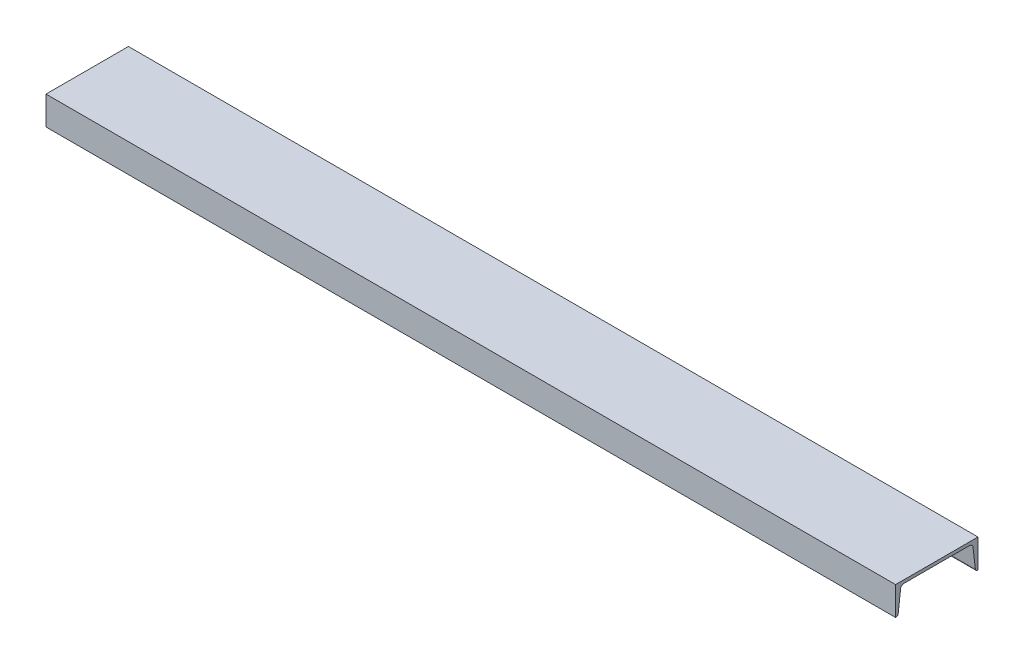
ISO-10303-21;
HEADER;
FILE_DESCRIPTION(('STEP AP214'),'2;1');
FILE_NAME('part.step','',(''),(''),'','','');
FILE_SCHEMA(('AUTOMOTIVE_DESIGN { 1 0 10303 214 1 1 1 1 }'));
ENDSEC;
DATA;
#1=APPLICATION_CONTEXT('core data for automotive mechanical design processes');
#2=APPLICATION_PROTOCOL_DEFINITION('international standard','automotive_design',2000,#1);
#3=PRODUCT_CONTEXT('',#1,'mechanical');
#4=PRODUCT('Part','Part','',(#3));
#5=PRODUCT_RELATED_PRODUCT_CATEGORY('part','',(#4));
#6=PRODUCT_DEFINITION_FORMATION('','',#4);
#7=PRODUCT_DEFINITION_CONTEXT('part definition',#1,'design');
#8=PRODUCT_DEFINITION('design','',#6,#7);
#9=PRODUCT_DEFINITION_SHAPE('','',#8);
#10=(LENGTH_UNIT() NAMED_UNIT(*) SI_UNIT(.MILLI.,.METRE.));
#11=(NAMED_UNIT(*) PLANE_ANGLE_UNIT() SI_UNIT($,.RADIAN.));
#12=(NAMED_UNIT(*) SI_UNIT($,.STERADIAN.) SOLID_ANGLE_UNIT());
#13=UNCERTAINTY_MEASURE_WITH_UNIT(LENGTH_MEASURE(1.E-05),#10,'distance_accuracy_value','');
#14=(GEOMETRIC_REPRESENTATION_CONTEXT(3) GLOBAL_UNCERTAINTY_ASSIGNED_CONTEXT((#13)) GLOBAL_UNIT_ASSIGNED_CONTEXT((#10,
#11,#12)) REPRESENTATION_CONTEXT('',''));
#15=CARTESIAN_POINT('',(0.,0.,0.));
#16=DIRECTION('',(0.,0.,1.));
#17=DIRECTION('',(1.,0.,0.));
#18=AXIS2_PLACEMENT_3D('',#15,#16,#17);
#19=CARTESIAN_POINT('',(2680.,0.,-130.));
#20=DIRECTION('',(0.,0.,-1.));
#21=DIRECTION('',(-1.,0.,0.));
#22=AXIS2_PLACEMENT_3D('',#19,#20,#21);
#23=PLANE('',#22);
#24=DIRECTION('',(0.,-1.,0.));
#25=VECTOR('',#24,1.);
#26=CARTESIAN_POINT('',(0.,0.,-130.));
#27=LINE('',#26,#25);
#28=CARTESIAN_POINT('',(0.,0.,-130.));
#29=VERTEX_POINT('',#28);
#30=CARTESIAN_POINT('',(0.,-90.,-130.));
#31=VERTEX_POINT('',#30);
#32=EDGE_CURVE('E157',#29,#31,#27,.T.);
#33=ORIENTED_EDGE('',*,*,#32,.F.);
#34=DIRECTION('',(-1.,0.,0.));
#35=VECTOR('',#34,1.);
#36=CARTESIAN_POINT('',(2680.,0.,-130.));
#37=LINE('',#36,#35);
#38=CARTESIAN_POINT('',(2680.,0.,-130.));
#39=VERTEX_POINT('',#38);
#40=EDGE_CURVE('E11',#39,#29,#37,.T.);
#41=ORIENTED_EDGE('',*,*,#40,.F.);
#42=DIRECTION('',(0.,-1.,0.));
#43=VECTOR('',#42,1.);
#44=CARTESIAN_POINT('',(2680.,0.,-130.));
#45=LINE('',#44,#43);
#46=CARTESIAN_POINT('',(2680.,-90.,-130.));
#47=VERTEX_POINT('',#46);
#48=EDGE_CURVE('E186',#39,#47,#45,.T.);
#49=ORIENTED_EDGE('',*,*,#48,.T.);
#50=DIRECTION('',(-1.,0.,0.));
#51=VECTOR('',#50,1.);
#52=CARTESIAN_POINT('',(2680.,-90.,-130.));
#53=LINE('',#52,#51);
#54=EDGE_CURVE('E38',#47,#31,#53,.T.);
#55=ORIENTED_EDGE('',*,*,#54,.T.);
#56=EDGE_LOOP('',(#33,#41,#49,#55));
#57=FACE_BOUND('',#56,.T.);
#58=ADVANCED_FACE('F35',(#57),#23,.T.);
#59=CARTESIAN_POINT('',(2680.,0.,-130.));
#60=DIRECTION('',(0.,-1.,0.));
#61=DIRECTION('',(0.,0.,-1.));
#62=AXIS2_PLACEMENT_3D('',#59,#60,#61);
#63=PLANE('',#62);
#64=DIRECTION('',(0.,0.,1.));
#65=VECTOR('',#64,1.);
#66=CARTESIAN_POINT('',(0.,0.,-130.));
#67=LINE('',#66,#65);
#68=CARTESIAN_POINT('',(0.,0.,130.));
#69=VERTEX_POINT('',#68);
#70=EDGE_CURVE('E92',#29,#69,#67,.T.);
#71=ORIENTED_EDGE('',*,*,#70,.T.);
#72=DIRECTION('',(-1.,0.,0.));
#73=VECTOR('',#72,1.);
#74=CARTESIAN_POINT('',(2680.,0.,130.));
#75=LINE('',#74,#73);
#76=CARTESIAN_POINT('',(2680.,0.,130.));
#77=VERTEX_POINT('',#76);
#78=EDGE_CURVE('E44',#77,#69,#75,.T.);
#79=ORIENTED_EDGE('',*,*,#78,.F.);
#80=DIRECTION('',(0.,0.,1.));
#81=VECTOR('',#80,1.);
#82=CARTESIAN_POINT('',(2680.,0.,-130.));
#83=LINE('',#82,#81);
#84=EDGE_CURVE('E135',#39,#77,#83,.T.);
#85=ORIENTED_EDGE('',*,*,#84,.F.);
#86=ORIENTED_EDGE('',*,*,#40,.T.);
#87=EDGE_LOOP('',(#71,#79,#85,#86));
#88=FACE_BOUND('',#87,.T.);
#89=ADVANCED_FACE('F262',(#88),#63,.F.);
#90=CARTESIAN_POINT('',(2680.,0.,130.));
#91=DIRECTION('',(0.,0.,-1.));
#92=DIRECTION('',(-1.,0.,0.));
#93=AXIS2_PLACEMENT_3D('',#90,#91,#92);
#94=PLANE('',#93);
#95=DIRECTION('',(0.,-1.,0.));
#96=VECTOR('',#95,1.);
#97=CARTESIAN_POINT('',(0.,0.,130.));
#98=LINE('',#97,#96);
#99=CARTESIAN_POINT('',(0.,-90.,130.));
#100=VERTEX_POINT('',#99);
#101=EDGE_CURVE('E142',#69,#100,#98,.T.);
#102=ORIENTED_EDGE('',*,*,#101,.T.);
#103=DIRECTION('',(-1.,0.,0.));
#104=VECTOR('',#103,1.);
#105=CARTESIAN_POINT('',(2680.,-90.,130.));
#106=LINE('',#105,#104);
#107=CARTESIAN_POINT('',(2680.,-90.,130.));
#108=VERTEX_POINT('',#107);
#109=EDGE_CURVE('E139',#108,#100,#106,.T.);
#110=ORIENTED_EDGE('',*,*,#109,.F.);
#111=DIRECTION('',(0.,-1.,0.));
#112=VECTOR('',#111,1.);
#113=CARTESIAN_POINT('',(2680.,0.,130.));
#114=LINE('',#113,#112);
#115=EDGE_CURVE('E128',#77,#108,#114,.T.);
#116=ORIENTED_EDGE('',*,*,#115,.F.);
#117=ORIENTED_EDGE('',*,*,#78,.T.);
#118=EDGE_LOOP('',(#102,#110,#116,#117));
#119=FACE_BOUND('',#118,.T.);
#120=ADVANCED_FACE('F140',(#119),#94,.F.);
#121=CARTESIAN_POINT('',(2680.,-90.,130.));
#122=DIRECTION('',(0.,1.,0.));
#123=DIRECTION('',(0.,0.,1.));
#124=AXIS2_PLACEMENT_3D('',#121,#122,#123);
#125=PLANE('',#124);
#126=DIRECTION('',(0.,0.,-1.));
#127=VECTOR('',#126,1.);
#128=CARTESIAN_POINT('',(0.,-90.,130.));
#129=LINE('',#128,#127);
#130=CARTESIAN_POINT('',(0.,-90.,128.678333405021));
#131=VERTEX_POINT('',#130);
#132=EDGE_CURVE('E183',#100,#131,#129,.T.);
#133=ORIENTED_EDGE('',*,*,#132,.T.);
#134=DIRECTION('',(-1.,0.,0.));
#135=VECTOR('',#134,1.);
#136=CARTESIAN_POINT('',(2680.,-90.,128.678333405021));
#137=LINE('',#136,#135);
#138=CARTESIAN_POINT('',(2680.,-90.,128.678333405021));
#139=VERTEX_POINT('',#138);
#140=EDGE_CURVE('E145',#139,#131,#137,.T.);
#141=ORIENTED_EDGE('',*,*,#140,.F.);
#142=DIRECTION('',(0.,0.,-1.));
#143=VECTOR('',#142,1.);
#144=CARTESIAN_POINT('',(2680.,-90.,130.));
#145=LINE('',#144,#143);
#146=EDGE_CURVE('E133',#108,#139,#145,.T.);
#147=ORIENTED_EDGE('',*,*,#146,.F.);
#148=ORIENTED_EDGE('',*,*,#109,.T.);
#149=EDGE_LOOP('',(#133,#141,#147,#148));
#150=FACE_BOUND('',#149,.T.);
#151=ADVANCED_FACE('F147',(#150),#125,.F.);
#152=CARTESIAN_POINT('',(2680.,-83.,128.678333405021));
#153=DIRECTION('',(-1.,0.,0.));
#154=DIRECTION('',(0.,0.,1.));
#155=AXIS2_PLACEMENT_3D('',#152,#153,#154);
#156=CYLINDRICAL_SURFACE('',#155,7.00000000000001);
#157=CARTESIAN_POINT('',(0.,-83.,128.678333405021));
#158=DIRECTION('',(1.,0.,0.));
#159=DIRECTION('',(0.,0.,-1.));
#160=AXIS2_PLACEMENT_3D('',#157,#158,#159);
#161=CIRCLE('',#160,7.00000000000001);
#162=CARTESIAN_POINT('',(0.,-83.8216184771156,121.726718982597));
#163=VERTEX_POINT('',#162);
#164=EDGE_CURVE('E180',#131,#163,#161,.T.);
#165=ORIENTED_EDGE('',*,*,#164,.T.);
#166=DIRECTION('',(-1.,0.,0.));
#167=VECTOR('',#166,1.);
#168=CARTESIAN_POINT('',(2680.,-83.8216184771156,121.726718982597));
#169=LINE('',#168,#167);
#170=CARTESIAN_POINT('',(2680.,-83.8216184771156,121.726718982597));
#171=VERTEX_POINT('',#170);
#172=EDGE_CURVE('E190',#171,#163,#169,.T.);
#173=ORIENTED_EDGE('',*,*,#172,.F.);
#174=CARTESIAN_POINT('',(2680.,-83.,128.678333405021));
#175=DIRECTION('',(1.,0.,0.));
#176=DIRECTION('',(0.,0.,-1.));
#177=AXIS2_PLACEMENT_3D('',#174,#175,#176);
#178=CIRCLE('',#177,7.00000000000001);
#179=EDGE_CURVE('E150',#139,#171,#178,.T.);
#180=ORIENTED_EDGE('',*,*,#179,.F.);
#181=ORIENTED_EDGE('',*,*,#140,.T.);
#182=EDGE_LOOP('',(#165,#173,#180,#181));
#183=FACE_BOUND('',#182,.T.);
#184=ADVANCED_FACE('F209',(#183),#156,.T.);
#185=CARTESIAN_POINT('',(2680.,-16.7206222894941,113.795983048398));
#186=DIRECTION('',(0.,-0.117374068159373,-0.993087774632091));
#187=DIRECTION('',(0.,0.993087774632091,-0.117374068159373));
#188=AXIS2_PLACEMENT_3D('',#185,#186,#187);
#189=PLANE('',#188);
#190=DIRECTION('',(0.,-0.993087774632091,0.117374068159373));
#191=VECTOR('',#190,1.);
#192=CARTESIAN_POINT('',(0.,-16.7206222894941,113.795983048398));
#193=LINE('',#192,#191);
#194=CARTESIAN_POINT('',(0.,-16.7206222894941,113.795983048398));
#195=VERTEX_POINT('',#194);
#196=EDGE_CURVE('E177',#195,#163,#193,.T.);
#197=ORIENTED_EDGE('',*,*,#196,.F.);
#198=DIRECTION('',(-1.,0.,0.));
#199=VECTOR('',#198,1.);
#200=CARTESIAN_POINT('',(2680.,-16.7206222894941,113.795983048398));
#201=LINE('',#200,#199);
#202=CARTESIAN_POINT('',(2680.,-16.7206222894941,113.795983048398));
#203=VERTEX_POINT('',#202);
#204=EDGE_CURVE('E192',#203,#195,#201,.T.);
#205=ORIENTED_EDGE('',*,*,#204,.F.);
#206=DIRECTION('',(0.,-0.993087774632091,0.117374068159373));
#207=VECTOR('',#206,1.);
#208=CARTESIAN_POINT('',(2680.,-16.7206222894941,113.795983048398));
#209=LINE('',#208,#207);
#210=EDGE_CURVE('E152',#203,#171,#209,.T.);
#211=ORIENTED_EDGE('',*,*,#210,.T.);
#212=ORIENTED_EDGE('',*,*,#172,.T.);
#213=EDGE_LOOP('',(#197,#205,#211,#212));
#214=FACE_BOUND('',#213,.T.);
#215=ADVANCED_FACE('F252',(#214),#189,.T.);
#216=CARTESIAN_POINT('',(2680.,-24.,101.837276590433));
#217=DIRECTION('',(-1.,0.,0.));
#218=DIRECTION('',(0.,0.,1.));
#219=AXIS2_PLACEMENT_3D('',#216,#217,#218);
#220=CYLINDRICAL_SURFACE('',#219,14.);
#221=CARTESIAN_POINT('',(0.,-24.,101.837276590433));
#222=DIRECTION('',(1.,0.,0.));
#223=DIRECTION('',(0.,0.,-1.));
#224=AXIS2_PLACEMENT_3D('',#221,#222,#223);
#225=CIRCLE('',#224,14.);
#226=CARTESIAN_POINT('',(0.,-10.,101.837276590433));
#227=VERTEX_POINT('',#226);
#228=EDGE_CURVE('E174',#227,#195,#225,.T.);
#229=ORIENTED_EDGE('',*,*,#228,.F.);
#230=DIRECTION('',(-1.,0.,0.));
#231=VECTOR('',#230,1.);
#232=CARTESIAN_POINT('',(2680.,-10.,101.837276590433));
#233=LINE('',#232,#231);
#234=CARTESIAN_POINT('',(2680.,-10.,101.837276590433));
#235=VERTEX_POINT('',#234);
#236=EDGE_CURVE('E194',#235,#227,#233,.T.);
#237=ORIENTED_EDGE('',*,*,#236,.F.);
#238=CARTESIAN_POINT('',(2680.,-24.,101.837276590433));
#239=DIRECTION('',(1.,0.,0.));
#240=DIRECTION('',(0.,0.,-1.));
#241=AXIS2_PLACEMENT_3D('',#238,#239,#240);
#242=CIRCLE('',#241,14.);
#243=EDGE_CURVE('E216',#235,#203,#242,.T.);
#244=ORIENTED_EDGE('',*,*,#243,.T.);
#245=ORIENTED_EDGE('',*,*,#204,.T.);
#246=EDGE_LOOP('',(#229,#237,#244,#245));
#247=FACE_BOUND('',#246,.T.);
#248=ADVANCED_FACE('F221',(#247),#220,.F.);
#249=CARTESIAN_POINT('',(2680.,-9.99999999999998,-101.837276590433));
#250=DIRECTION('',(0.,-1.,0.));
#251=DIRECTION('',(0.,0.,-1.));
#252=AXIS2_PLACEMENT_3D('',#249,#250,#251);
#253=PLANE('',#252);
#254=DIRECTION('',(0.,0.,1.));
#255=VECTOR('',#254,1.);
#256=CARTESIAN_POINT('',(0.,-9.99999999999998,-101.837276590433));
#257=LINE('',#256,#255);
#258=CARTESIAN_POINT('',(0.,-9.99999999999998,-101.837276590433));
#259=VERTEX_POINT('',#258);
#260=EDGE_CURVE('E171',#259,#227,#257,.T.);
#261=ORIENTED_EDGE('',*,*,#260,.F.);
#262=DIRECTION('',(-1.,0.,0.));
#263=VECTOR('',#262,1.);
#264=CARTESIAN_POINT('',(2680.,-9.99999999999998,-101.837276590433));
#265=LINE('',#264,#263);
#266=CARTESIAN_POINT('',(2680.,-9.99999999999998,-101.837276590433));
#267=VERTEX_POINT('',#266);
#268=EDGE_CURVE('E196',#267,#259,#265,.T.);
#269=ORIENTED_EDGE('',*,*,#268,.F.);
#270=DIRECTION('',(0.,0.,1.));
#271=VECTOR('',#270,1.);
#272=CARTESIAN_POINT('',(2680.,-9.99999999999998,-101.837276590433));
#273=LINE('',#272,#271);
#274=EDGE_CURVE('E223',#267,#235,#273,.T.);
#275=ORIENTED_EDGE('',*,*,#274,.T.);
#276=ORIENTED_EDGE('',*,*,#236,.T.);
#277=EDGE_LOOP('',(#261,#269,#275,#276));
#278=FACE_BOUND('',#277,.T.);
#279=ADVANCED_FACE('F251',(#278),#253,.T.);
#280=CARTESIAN_POINT('',(2680.,-24.,-101.837276590433));
#281=DIRECTION('',(-1.,0.,0.));
#282=DIRECTION('',(0.,0.,1.));
#283=AXIS2_PLACEMENT_3D('',#280,#281,#282);
#284=CYLINDRICAL_SURFACE('',#283,14.);
#285=CARTESIAN_POINT('',(0.,-24.,-101.837276590433));
#286=DIRECTION('',(-1.,0.,0.));
#287=DIRECTION('',(0.,0.,1.));
#288=AXIS2_PLACEMENT_3D('',#285,#286,#287);
#289=CIRCLE('',#288,14.);
#290=CARTESIAN_POINT('',(0.,-16.7206222894941,-113.795983048398));
#291=VERTEX_POINT('',#290);
#292=EDGE_CURVE('E169',#259,#291,#289,.T.);
#293=ORIENTED_EDGE('',*,*,#292,.T.);
#294=DIRECTION('',(-1.,0.,0.));
#295=VECTOR('',#294,1.);
#296=CARTESIAN_POINT('',(2680.,-16.7206222894941,-113.795983048398));
#297=LINE('',#296,#295);
#298=CARTESIAN_POINT('',(2680.,-16.7206222894941,-113.795983048398));
#299=VERTEX_POINT('',#298);
#300=EDGE_CURVE('E198',#299,#291,#297,.T.);
#301=ORIENTED_EDGE('',*,*,#300,.F.);
#302=CARTESIAN_POINT('',(2680.,-24.,-101.837276590433));
#303=DIRECTION('',(-1.,0.,0.));
#304=DIRECTION('',(0.,0.,1.));
#305=AXIS2_PLACEMENT_3D('',#302,#303,#304);
#306=CIRCLE('',#305,14.);
#307=EDGE_CURVE('E225',#267,#299,#306,.T.);
#308=ORIENTED_EDGE('',*,*,#307,.F.);
#309=ORIENTED_EDGE('',*,*,#268,.T.);
#310=EDGE_LOOP('',(#293,#301,#308,#309));
#311=FACE_BOUND('',#310,.T.);
#312=ADVANCED_FACE('F249',(#311),#284,.F.);
#313=CARTESIAN_POINT('',(2680.,-16.7206222894941,-113.795983048398));
#314=DIRECTION('',(0.,0.117374068159373,-0.993087774632091));
#315=DIRECTION('',(0.,0.993087774632091,0.117374068159373));
#316=AXIS2_PLACEMENT_3D('',#313,#314,#315);
#317=PLANE('',#316);
#318=DIRECTION('',(0.,-0.993087774632091,-0.117374068159373));
#319=VECTOR('',#318,1.);
#320=CARTESIAN_POINT('',(0.,-16.7206222894941,-113.795983048398));
#321=LINE('',#320,#319);
#322=CARTESIAN_POINT('',(0.,-83.8216184771156,-121.726718982597));
#323=VERTEX_POINT('',#322);
#324=EDGE_CURVE('E166',#291,#323,#321,.T.);
#325=ORIENTED_EDGE('',*,*,#324,.T.);
#326=DIRECTION('',(-1.,0.,0.));
#327=VECTOR('',#326,1.);
#328=CARTESIAN_POINT('',(2680.,-83.8216184771156,-121.726718982597));
#329=LINE('',#328,#327);
#330=CARTESIAN_POINT('',(2680.,-83.8216184771156,-121.726718982597));
#331=VERTEX_POINT('',#330);
#332=EDGE_CURVE('E201',#331,#323,#329,.T.);
#333=ORIENTED_EDGE('',*,*,#332,.F.);
#334=DIRECTION('',(0.,-0.993087774632091,-0.117374068159373));
#335=VECTOR('',#334,1.);
#336=CARTESIAN_POINT('',(2680.,-16.7206222894941,-113.795983048398));
#337=LINE('',#336,#335);
#338=EDGE_CURVE('E229',#299,#331,#337,.T.);
#339=ORIENTED_EDGE('',*,*,#338,.F.);
#340=ORIENTED_EDGE('',*,*,#300,.T.);
#341=EDGE_LOOP('',(#325,#333,#339,#340));
#342=FACE_BOUND('',#341,.T.);
#343=ADVANCED_FACE('F245',(#342),#317,.F.);
#344=CARTESIAN_POINT('',(2680.,-83.,-128.678333405021));
#345=DIRECTION('',(-1.,0.,0.));
#346=DIRECTION('',(0.,0.,1.));
#347=AXIS2_PLACEMENT_3D('',#344,#345,#346);
#348=CYLINDRICAL_SURFACE('',#347,6.99999999999999);
#349=CARTESIAN_POINT('',(0.,-83.,-128.678333405021));
#350=DIRECTION('',(-1.,0.,0.));
#351=DIRECTION('',(0.,0.,1.));
#352=AXIS2_PLACEMENT_3D('',#349,#350,#351);
#353=CIRCLE('',#352,6.99999999999999);
#354=CARTESIAN_POINT('',(0.,-90.,-128.678333405021));
#355=VERTEX_POINT('',#354);
#356=EDGE_CURVE('E163',#355,#323,#353,.T.);
#357=ORIENTED_EDGE('',*,*,#356,.F.);
#358=DIRECTION('',(-1.,0.,0.));
#359=VECTOR('',#358,1.);
#360=CARTESIAN_POINT('',(2680.,-90.,-128.678333405021));
#361=LINE('',#360,#359);
#362=CARTESIAN_POINT('',(2680.,-90.,-128.678333405021));
#363=VERTEX_POINT('',#362);
#364=EDGE_CURVE('E202',#363,#355,#361,.T.);
#365=ORIENTED_EDGE('',*,*,#364,.F.);
#366=CARTESIAN_POINT('',(2680.,-83.,-128.678333405021));
#367=DIRECTION('',(-1.,0.,0.));
#368=DIRECTION('',(0.,0.,1.));
#369=AXIS2_PLACEMENT_3D('',#366,#367,#368);
#370=CIRCLE('',#369,6.99999999999999);
#371=EDGE_CURVE('E231',#363,#331,#370,.T.);
#372=ORIENTED_EDGE('',*,*,#371,.T.);
#373=ORIENTED_EDGE('',*,*,#332,.T.);
#374=EDGE_LOOP('',(#357,#365,#372,#373));
#375=FACE_BOUND('',#374,.T.);
#376=ADVANCED_FACE('F240',(#375),#348,.T.);
#377=CARTESIAN_POINT('',(2680.,-90.,-130.));
#378=DIRECTION('',(0.,-1.,0.));
#379=DIRECTION('',(0.,0.,-1.));
#380=AXIS2_PLACEMENT_3D('',#377,#378,#379);
#381=PLANE('',#380);
#382=DIRECTION('',(0.,0.,1.));
#383=VECTOR('',#382,1.);
#384=CARTESIAN_POINT('',(0.,-90.,-130.));
#385=LINE('',#384,#383);
#386=EDGE_CURVE('E160',#31,#355,#385,.T.);
#387=ORIENTED_EDGE('',*,*,#386,.F.);
#388=ORIENTED_EDGE('',*,*,#54,.F.);
#389=DIRECTION('',(0.,0.,1.));
#390=VECTOR('',#389,1.);
#391=CARTESIAN_POINT('',(2680.,-90.,-130.));
#392=LINE('',#391,#390);
#393=EDGE_CURVE('E234',#47,#363,#392,.T.);
#394=ORIENTED_EDGE('',*,*,#393,.T.);
#395=ORIENTED_EDGE('',*,*,#364,.T.);
#396=EDGE_LOOP('',(#387,#388,#394,#395));
#397=FACE_BOUND('',#396,.T.);
#398=ADVANCED_FACE('F204',(#397),#381,.T.);
#399=CARTESIAN_POINT('',(2680.,-83.,-128.678333405021));
#400=DIRECTION('',(-1.,0.,0.));
#401=DIRECTION('',(0.,0.,1.));
#402=AXIS2_PLACEMENT_3D('',#399,#400,#401);
#403=PLANE('',#402);
#404=ORIENTED_EDGE('',*,*,#48,.F.);
#405=ORIENTED_EDGE('',*,*,#84,.T.);
#406=ORIENTED_EDGE('',*,*,#115,.T.);
#407=ORIENTED_EDGE('',*,*,#146,.T.);
#408=ORIENTED_EDGE('',*,*,#179,.T.);
#409=ORIENTED_EDGE('',*,*,#210,.F.);
#410=ORIENTED_EDGE('',*,*,#243,.F.);
#411=ORIENTED_EDGE('',*,*,#274,.F.);
#412=ORIENTED_EDGE('',*,*,#307,.T.);
#413=ORIENTED_EDGE('',*,*,#338,.T.);
#414=ORIENTED_EDGE('',*,*,#371,.F.);
#415=ORIENTED_EDGE('',*,*,#393,.F.);
#416=EDGE_LOOP('',(#404,#405,#406,#407,#408,#409,#410,#411,#412,#413,#414,#415));
#417=FACE_BOUND('',#416,.T.);
#418=ADVANCED_FACE('F131',(#417),#403,.F.);
#419=CARTESIAN_POINT('',(0.,-83.,-128.678333405021));
#420=DIRECTION('',(-1.,0.,0.));
#421=DIRECTION('',(0.,0.,1.));
#422=AXIS2_PLACEMENT_3D('',#419,#420,#421);
#423=PLANE('',#422);
#424=ORIENTED_EDGE('',*,*,#32,.T.);
#425=ORIENTED_EDGE('',*,*,#386,.T.);
#426=ORIENTED_EDGE('',*,*,#356,.T.);
#427=ORIENTED_EDGE('',*,*,#324,.F.);
#428=ORIENTED_EDGE('',*,*,#292,.F.);
#429=ORIENTED_EDGE('',*,*,#260,.T.);
#430=ORIENTED_EDGE('',*,*,#228,.T.);
#431=ORIENTED_EDGE('',*,*,#196,.T.);
#432=ORIENTED_EDGE('',*,*,#164,.F.);
#433=ORIENTED_EDGE('',*,*,#132,.F.);
#434=ORIENTED_EDGE('',*,*,#101,.F.);
#435=ORIENTED_EDGE('',*,*,#70,.F.);
#436=EDGE_LOOP('',(#424,#425,#426,#427,#428,#429,#430,#431,#432,#433,#434,#435));
#437=FACE_BOUND('',#436,.T.);
#438=ADVANCED_FACE('F206',(#437),#423,.T.);
#439=CLOSED_SHELL('',(#58,#89,#120,#151,#184,#215,#248,#279,#312,#343,#376,#398,#418,#438));
#440=MANIFOLD_SOLID_BREP('B2',#439);
#441=ADVANCED_BREP_SHAPE_REPRESENTATION('',(#18,#440),#14);
#442=SHAPE_DEFINITION_REPRESENTATION(#9,#441);
ENDSEC;
END-ISO-10303-21;
